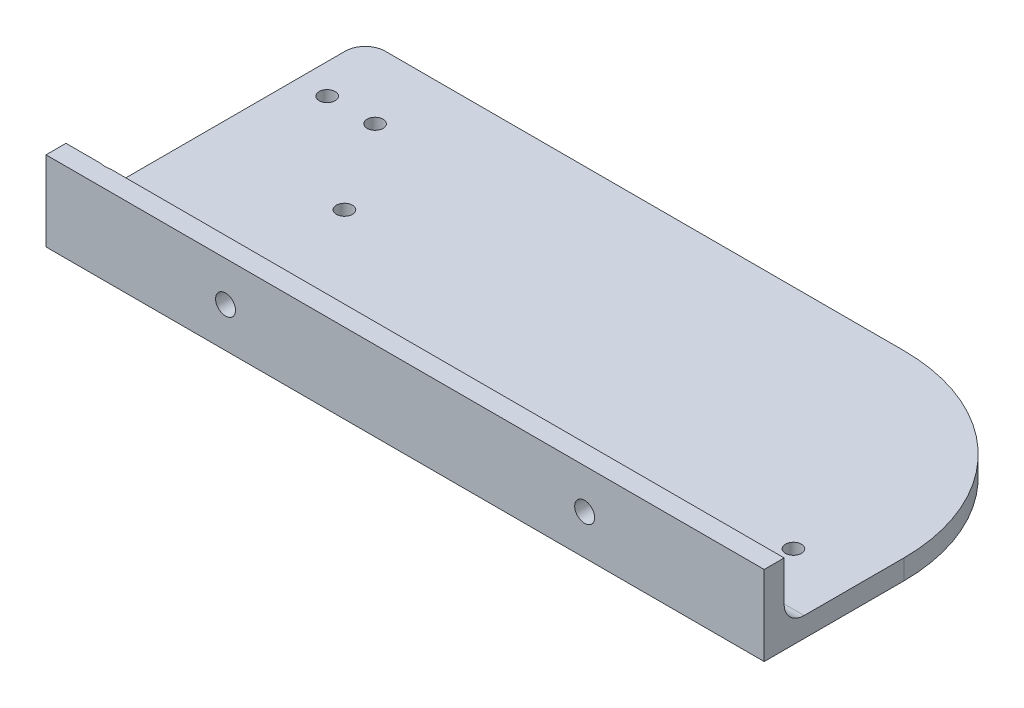
ISO-10303-21;
HEADER;
FILE_DESCRIPTION(('STEP AP214'),'2;1');
FILE_NAME('part.step','',(''),(''),'','','');
FILE_SCHEMA(('AUTOMOTIVE_DESIGN { 1 0 10303 214 1 1 1 1 }'));
ENDSEC;
DATA;
#1=APPLICATION_CONTEXT('core data for automotive mechanical design processes');
#2=APPLICATION_PROTOCOL_DEFINITION('international standard','automotive_design',2000,#1);
#3=PRODUCT_CONTEXT('',#1,'mechanical');
#4=PRODUCT('Part','Part','',(#3));
#5=PRODUCT_RELATED_PRODUCT_CATEGORY('part','',(#4));
#6=PRODUCT_DEFINITION_FORMATION('','',#4);
#7=PRODUCT_DEFINITION_CONTEXT('part definition',#1,'design');
#8=PRODUCT_DEFINITION('design','',#6,#7);
#9=PRODUCT_DEFINITION_SHAPE('','',#8);
#10=(LENGTH_UNIT() NAMED_UNIT(*) SI_UNIT(.MILLI.,.METRE.));
#11=(NAMED_UNIT(*) PLANE_ANGLE_UNIT() SI_UNIT($,.RADIAN.));
#12=(NAMED_UNIT(*) SI_UNIT($,.STERADIAN.) SOLID_ANGLE_UNIT());
#13=UNCERTAINTY_MEASURE_WITH_UNIT(LENGTH_MEASURE(1.E-05),#10,'distance_accuracy_value','');
#14=(GEOMETRIC_REPRESENTATION_CONTEXT(3) GLOBAL_UNCERTAINTY_ASSIGNED_CONTEXT((#13)) GLOBAL_UNIT_ASSIGNED_CONTEXT((#10,
#11,#12)) REPRESENTATION_CONTEXT('',''));
#15=CARTESIAN_POINT('',(0.,0.,0.));
#16=DIRECTION('',(0.,0.,1.));
#17=DIRECTION('',(1.,0.,0.));
#18=AXIS2_PLACEMENT_3D('',#15,#16,#17);
#19=CARTESIAN_POINT('',(-43.5930960469009,25.4,45.0477144987486));
#20=DIRECTION('',(0.,0.,-1.));
#21=DIRECTION('',(-1.,0.,0.));
#22=AXIS2_PLACEMENT_3D('',#19,#20,#21);
#23=PLANE('',#22);
#24=DIRECTION('',(0.,-1.,0.));
#25=VECTOR('',#24,1.);
#26=CARTESIAN_POINT('',(185.006903953099,25.4,45.0477144987486));
#27=LINE('',#26,#25);
#28=CARTESIAN_POINT('',(185.006903953099,25.4,45.0477144987486));
#29=VERTEX_POINT('',#28);
#30=CARTESIAN_POINT('',(185.006903953099,12.7,45.0477144987486));
#31=VERTEX_POINT('',#30);
#32=EDGE_CURVE('E186',#29,#31,#27,.T.);
#33=ORIENTED_EDGE('',*,*,#32,.T.);
#34=DIRECTION('',(1.,0.,0.));
#35=VECTOR('',#34,1.);
#36=CARTESIAN_POINT('',(-29.2310409014925,12.7,45.0477144987486));
#37=LINE('',#36,#35);
#38=CARTESIAN_POINT('',(131.031903953099,12.7,45.0477144987486));
#39=VERTEX_POINT('',#38);
#40=EDGE_CURVE('E244',#31,#39,#37,.F.);
#41=ORIENTED_EDGE('',*,*,#40,.T.);
#42=CARTESIAN_POINT('',(127.856903953099,12.7,45.0477144987486));
#43=DIRECTION('',(0.,0.,-1.));
#44=DIRECTION('',(-1.,0.,0.));
#45=AXIS2_PLACEMENT_3D('',#42,#43,#44);
#46=CIRCLE('',#45,3.175);
#47=CARTESIAN_POINT('',(124.681903953099,12.7,45.0477144987486));
#48=VERTEX_POINT('',#47);
#49=EDGE_CURVE('E408',#39,#48,#46,.F.);
#50=ORIENTED_EDGE('',*,*,#49,.T.);
#51=DIRECTION('',(1.,0.,0.));
#52=VECTOR('',#51,1.);
#53=CARTESIAN_POINT('',(-29.2310409014925,12.7,45.0477144987486));
#54=LINE('',#53,#52);
#55=CARTESIAN_POINT('',(16.7319039530991,12.7,45.0477144987486));
#56=VERTEX_POINT('',#55);
#57=EDGE_CURVE('E242',#48,#56,#54,.F.);
#58=ORIENTED_EDGE('',*,*,#57,.T.);
#59=CARTESIAN_POINT('',(13.5569039530991,12.7,45.0477144987486));
#60=DIRECTION('',(0.,0.,-1.));
#61=DIRECTION('',(-1.,0.,0.));
#62=AXIS2_PLACEMENT_3D('',#59,#60,#61);
#63=CIRCLE('',#62,3.175);
#64=CARTESIAN_POINT('',(10.3819039530991,12.7,45.0477144987486));
#65=VERTEX_POINT('',#64);
#66=EDGE_CURVE('E416',#56,#65,#63,.F.);
#67=ORIENTED_EDGE('',*,*,#66,.T.);
#68=DIRECTION('',(1.,0.,0.));
#69=VECTOR('',#68,1.);
#70=CARTESIAN_POINT('',(-29.2310409014925,12.7,45.0477144987486));
#71=LINE('',#70,#69);
#72=CARTESIAN_POINT('',(-29.2310409014925,12.7,45.0477144987486));
#73=VERTEX_POINT('',#72);
#74=EDGE_CURVE('E72',#65,#73,#71,.F.);
#75=ORIENTED_EDGE('',*,*,#74,.T.);
#76=DIRECTION('',(0.,-1.,0.));
#77=VECTOR('',#76,1.);
#78=CARTESIAN_POINT('',(-29.2310409014925,0.,45.0477144987486));
#79=LINE('',#78,#77);
#80=CARTESIAN_POINT('',(-29.2310409014925,25.4,45.0477144987486));
#81=VERTEX_POINT('',#80);
#82=EDGE_CURVE('E154',#81,#73,#79,.T.);
#83=ORIENTED_EDGE('',*,*,#82,.F.);
#84=DIRECTION('',(1.,0.,0.));
#85=VECTOR('',#84,1.);
#86=CARTESIAN_POINT('',(-43.5930960469009,25.4,45.0477144987486));
#87=LINE('',#86,#85);
#88=EDGE_CURVE('E165',#81,#29,#87,.T.);
#89=ORIENTED_EDGE('',*,*,#88,.T.);
#90=EDGE_LOOP('',(#33,#41,#50,#58,#67,#75,#83,#89));
#91=FACE_BOUND('',#90,.T.);
#92=ADVANCED_FACE('F43',(#91),#23,.T.);
#93=CARTESIAN_POINT('',(0.,6.35,0.));
#94=DIRECTION('',(0.,1.,0.));
#95=DIRECTION('',(0.,0.,1.));
#96=AXIS2_PLACEMENT_3D('',#93,#94,#95);
#97=PLANE('',#96);
#98=DIRECTION('',(0.,0.,1.));
#99=VECTOR('',#98,1.);
#100=CARTESIAN_POINT('',(-43.5930960469009,6.35,-50.2022855012514));
#101=LINE('',#100,#99);
#102=CARTESIAN_POINT('',(-43.5930960469009,6.35,-43.8522855012514));
#103=VERTEX_POINT('',#102);
#104=CARTESIAN_POINT('',(-43.5930960469009,6.35,38.6977144987486));
#105=VERTEX_POINT('',#104);
#106=EDGE_CURVE('E191',#103,#105,#101,.T.);
#107=ORIENTED_EDGE('',*,*,#106,.T.);
#108=DIRECTION('',(1.,0.,0.));
#109=VECTOR('',#108,1.);
#110=CARTESIAN_POINT('',(-32.5551511923092,6.35,38.6977144987486));
#111=LINE('',#110,#109);
#112=CARTESIAN_POINT('',(-38.0117968722261,6.35,38.6977144987486));
#113=VERTEX_POINT('',#112);
#114=EDGE_CURVE('E236',#105,#113,#111,.T.);
#115=ORIENTED_EDGE('',*,*,#114,.T.);
#116=CARTESIAN_POINT('',(-30.8930960469009,6.35,38.1));
#117=DIRECTION('',(0.,1.,0.));
#118=DIRECTION('',(0.,0.,1.));
#119=AXIS2_PLACEMENT_3D('',#116,#117,#118);
#120=CIRCLE('',#119,7.14374999999999);
#121=CARTESIAN_POINT('',(-23.7743952215757,6.35,38.6977144987486));
#122=VERTEX_POINT('',#121);
#123=EDGE_CURVE('E162',#122,#113,#120,.T.);
#124=ORIENTED_EDGE('',*,*,#123,.F.);
#125=DIRECTION('',(1.,0.,0.));
#126=VECTOR('',#125,1.);
#127=CARTESIAN_POINT('',(185.006903953099,6.35,38.6977144987486));
#128=LINE('',#127,#126);
#129=CARTESIAN_POINT('',(185.006903953099,6.35,38.6977144987486));
#130=VERTEX_POINT('',#129);
#131=EDGE_CURVE('E233',#122,#130,#128,.T.);
#132=ORIENTED_EDGE('',*,*,#131,.T.);
#133=DIRECTION('',(0.,0.,-1.));
#134=VECTOR('',#133,1.);
#135=CARTESIAN_POINT('',(185.006903953099,6.35,-50.2022855012514));
#136=LINE('',#135,#134);
#137=CARTESIAN_POINT('',(185.006903953099,6.35,6.94771449874861));
#138=VERTEX_POINT('',#137);
#139=EDGE_CURVE('E194',#130,#138,#136,.T.);
#140=ORIENTED_EDGE('',*,*,#139,.T.);
#141=CARTESIAN_POINT('',(127.856903953099,6.35,6.94771449874861));
#142=DIRECTION('',(0.,1.,0.));
#143=DIRECTION('',(0.,0.,1.));
#144=AXIS2_PLACEMENT_3D('',#141,#142,#143);
#145=CIRCLE('',#144,57.15);
#146=CARTESIAN_POINT('',(127.856903953099,6.35,-50.2022855012514));
#147=VERTEX_POINT('',#146);
#148=EDGE_CURVE('E228',#138,#147,#145,.T.);
#149=ORIENTED_EDGE('',*,*,#148,.T.);
#150=DIRECTION('',(-1.,0.,0.));
#151=VECTOR('',#150,1.);
#152=CARTESIAN_POINT('',(-43.5930960469009,6.35,-50.2022855012514));
#153=LINE('',#152,#151);
#154=CARTESIAN_POINT('',(-37.2430960469009,6.35,-50.2022855012514));
#155=VERTEX_POINT('',#154);
#156=EDGE_CURVE('E197',#147,#155,#153,.T.);
#157=ORIENTED_EDGE('',*,*,#156,.T.);
#158=CARTESIAN_POINT('',(-37.2430960469009,6.35,-43.8522855012514));
#159=DIRECTION('',(0.,1.,0.));
#160=DIRECTION('',(0.,0.,1.));
#161=AXIS2_PLACEMENT_3D('',#158,#159,#160);
#162=CIRCLE('',#161,6.35);
#163=EDGE_CURVE('E226',#155,#103,#162,.T.);
#164=ORIENTED_EDGE('',*,*,#163,.T.);
#165=EDGE_LOOP('',(#107,#115,#124,#132,#140,#149,#157,#164));
#166=FACE_BOUND('',#165,.T.);
#167=CARTESIAN_POINT('',(-34.0680960469009,6.35,-28.575));
#168=DIRECTION('',(0.,1.,0.));
#169=DIRECTION('',(0.,0.,1.));
#170=AXIS2_PLACEMENT_3D('',#167,#168,#169);
#171=CIRCLE('',#170,2.5527);
#172=CARTESIAN_POINT('',(-34.0680960469009,6.35,-26.0223));
#173=VERTEX_POINT('',#172);
#174=EDGE_CURVE('E423',#173,#173,#171,.T.);
#175=ORIENTED_EDGE('',*,*,#174,.F.);
#176=EDGE_LOOP('',(#175));
#177=FACE_BOUND('',#176,.T.);
#178=CARTESIAN_POINT('',(-18.8280960469009,6.35,-28.575));
#179=DIRECTION('',(0.,1.,0.));
#180=DIRECTION('',(0.,0.,1.));
#181=AXIS2_PLACEMENT_3D('',#178,#179,#180);
#182=CIRCLE('',#181,2.5527);
#183=CARTESIAN_POINT('',(-18.8280960469009,6.35,-26.0223));
#184=VERTEX_POINT('',#183);
#185=EDGE_CURVE('E429',#184,#184,#182,.T.);
#186=ORIENTED_EDGE('',*,*,#185,.F.);
#187=EDGE_LOOP('',(#186));
#188=FACE_BOUND('',#187,.T.);
#189=CARTESIAN_POINT('',(0.,6.35,0.));
#190=DIRECTION('',(0.,1.,0.));
#191=DIRECTION('',(0.,0.,1.));
#192=AXIS2_PLACEMENT_3D('',#189,#190,#191);
#193=CIRCLE('',#192,2.5527);
#194=CARTESIAN_POINT('',(0.,6.35,2.5527));
#195=VERTEX_POINT('',#194);
#196=EDGE_CURVE('E435',#195,#195,#193,.T.);
#197=ORIENTED_EDGE('',*,*,#196,.F.);
#198=EDGE_LOOP('',(#197));
#199=FACE_BOUND('',#198,.T.);
#200=CARTESIAN_POINT('',(164.907701135125,6.35,21.9875101453017));
#201=DIRECTION('',(0.,1.,0.));
#202=DIRECTION('',(0.,0.,1.));
#203=AXIS2_PLACEMENT_3D('',#200,#201,#202);
#204=CIRCLE('',#203,2.55269999999999);
#205=CARTESIAN_POINT('',(164.907701135125,6.35,24.5402101453017));
#206=VERTEX_POINT('',#205);
#207=EDGE_CURVE('E441',#206,#206,#204,.T.);
#208=ORIENTED_EDGE('',*,*,#207,.F.);
#209=EDGE_LOOP('',(#208));
#210=FACE_BOUND('',#209,.T.);
#211=ADVANCED_FACE('F276',(#166,#177,#188,#199,#210),#97,.T.);
#212=CARTESIAN_POINT('',(-43.5930960469009,6.35,-50.2022855012514));
#213=DIRECTION('',(1.,0.,0.));
#214=DIRECTION('',(0.,0.,-1.));
#215=AXIS2_PLACEMENT_3D('',#212,#213,#214);
#216=PLANE('',#215);
#217=ORIENTED_EDGE('',*,*,#106,.F.);
#218=DIRECTION('',(0.,-1.,0.));
#219=VECTOR('',#218,1.);
#220=CARTESIAN_POINT('',(-43.5930960469009,6.35,-43.8522855012514));
#221=LINE('',#220,#219);
#222=CARTESIAN_POINT('',(-43.5930960469009,0.,-43.8522855012514));
#223=VERTEX_POINT('',#222);
#224=EDGE_CURVE('E230',#103,#223,#221,.T.);
#225=ORIENTED_EDGE('',*,*,#224,.T.);
#226=DIRECTION('',(0.,0.,1.));
#227=VECTOR('',#226,1.);
#228=CARTESIAN_POINT('',(-43.5930960469009,0.,-50.2022855012514));
#229=LINE('',#228,#227);
#230=CARTESIAN_POINT('',(-43.5930960469009,0.,51.3977144987486));
#231=VERTEX_POINT('',#230);
#232=EDGE_CURVE('E188',#223,#231,#229,.T.);
#233=ORIENTED_EDGE('',*,*,#232,.T.);
#234=DIRECTION('',(0.,-1.,0.));
#235=VECTOR('',#234,1.);
#236=CARTESIAN_POINT('',(-43.5930960469009,6.35,51.3977144987486));
#237=LINE('',#236,#235);
#238=CARTESIAN_POINT('',(-43.5930960469009,25.4,51.3977144987486));
#239=VERTEX_POINT('',#238);
#240=EDGE_CURVE('E211',#239,#231,#237,.T.);
#241=ORIENTED_EDGE('',*,*,#240,.F.);
#242=DIRECTION('',(0.,0.,-1.));
#243=VECTOR('',#242,1.);
#244=CARTESIAN_POINT('',(-43.5930960469009,25.4,51.3977144987486));
#245=LINE('',#244,#243);
#246=CARTESIAN_POINT('',(-43.5930960469009,25.4,45.0477144987486));
#247=VERTEX_POINT('',#246);
#248=EDGE_CURVE('E174',#239,#247,#245,.T.);
#249=ORIENTED_EDGE('',*,*,#248,.T.);
#250=DIRECTION('',(0.,-1.,0.));
#251=VECTOR('',#250,1.);
#252=CARTESIAN_POINT('',(-43.5930960469009,25.4,45.0477144987486));
#253=LINE('',#252,#251);
#254=CARTESIAN_POINT('',(-43.5930960469009,12.7,45.0477144987486));
#255=VERTEX_POINT('',#254);
#256=EDGE_CURVE('E185',#247,#255,#253,.T.);
#257=ORIENTED_EDGE('',*,*,#256,.T.);
#258=CARTESIAN_POINT('',(-43.5930960469009,12.7,38.6977144987486));
#259=DIRECTION('',(1.,0.,0.));
#260=DIRECTION('',(0.,0.,-1.));
#261=AXIS2_PLACEMENT_3D('',#258,#259,#260);
#262=CIRCLE('',#261,6.35);
#263=EDGE_CURVE('E252',#255,#105,#262,.T.);
#264=ORIENTED_EDGE('',*,*,#263,.T.);
#265=EDGE_LOOP('',(#217,#225,#233,#241,#249,#257,#264));
#266=FACE_BOUND('',#265,.T.);
#267=ADVANCED_FACE('F272',(#266),#216,.F.);
#268=CARTESIAN_POINT('',(-43.5930960469009,6.35,51.3977144987486));
#269=DIRECTION('',(0.,0.,-1.));
#270=DIRECTION('',(-1.,0.,0.));
#271=AXIS2_PLACEMENT_3D('',#268,#269,#270);
#272=PLANE('',#271);
#273=CARTESIAN_POINT('',(127.856903953099,12.7,51.3977144987486));
#274=DIRECTION('',(0.,0.,1.));
#275=DIRECTION('',(1.,0.,0.));
#276=AXIS2_PLACEMENT_3D('',#273,#274,#275);
#277=CIRCLE('',#276,3.175);
#278=CARTESIAN_POINT('',(131.031903953099,12.7,51.3977144987486));
#279=VERTEX_POINT('',#278);
#280=EDGE_CURVE('E410',#279,#279,#277,.T.);
#281=ORIENTED_EDGE('',*,*,#280,.F.);
#282=EDGE_LOOP('',(#281));
#283=FACE_BOUND('',#282,.T.);
#284=CARTESIAN_POINT('',(13.5569039530991,12.7,51.3977144987486));
#285=DIRECTION('',(0.,0.,1.));
#286=DIRECTION('',(-1.,0.,0.));
#287=AXIS2_PLACEMENT_3D('',#284,#285,#286);
#288=CIRCLE('',#287,3.175);
#289=CARTESIAN_POINT('',(10.3819039530991,12.7,51.3977144987486));
#290=VERTEX_POINT('',#289);
#291=EDGE_CURVE('E411',#290,#290,#288,.T.);
#292=ORIENTED_EDGE('',*,*,#291,.F.);
#293=EDGE_LOOP('',(#292));
#294=FACE_BOUND('',#293,.T.);
#295=DIRECTION('',(1.,0.,0.));
#296=VECTOR('',#295,1.);
#297=CARTESIAN_POINT('',(-43.5930960469009,0.,51.3977144987486));
#298=LINE('',#297,#296);
#299=CARTESIAN_POINT('',(185.006903953099,0.,51.3977144987486));
#300=VERTEX_POINT('',#299);
#301=EDGE_CURVE('E202',#231,#300,#298,.T.);
#302=ORIENTED_EDGE('',*,*,#301,.T.);
#303=DIRECTION('',(0.,-1.,0.));
#304=VECTOR('',#303,1.);
#305=CARTESIAN_POINT('',(185.006903953099,6.35,51.3977144987486));
#306=LINE('',#305,#304);
#307=CARTESIAN_POINT('',(185.006903953099,25.4,51.3977144987486));
#308=VERTEX_POINT('',#307);
#309=EDGE_CURVE('E200',#308,#300,#306,.T.);
#310=ORIENTED_EDGE('',*,*,#309,.F.);
#311=DIRECTION('',(-1.,0.,0.));
#312=VECTOR('',#311,1.);
#313=CARTESIAN_POINT('',(-43.5930960469009,25.4,51.3977144987486));
#314=LINE('',#313,#312);
#315=EDGE_CURVE('E182',#308,#239,#314,.T.);
#316=ORIENTED_EDGE('',*,*,#315,.T.);
#317=ORIENTED_EDGE('',*,*,#240,.T.);
#318=EDGE_LOOP('',(#302,#310,#316,#317));
#319=FACE_BOUND('',#318,.T.);
#320=ADVANCED_FACE('F275',(#283,#294,#319),#272,.F.);
#321=CARTESIAN_POINT('',(185.006903953099,6.35,-50.2022855012514));
#322=DIRECTION('',(-1.,0.,0.));
#323=DIRECTION('',(0.,0.,1.));
#324=AXIS2_PLACEMENT_3D('',#321,#322,#323);
#325=PLANE('',#324);
#326=DIRECTION('',(0.,0.,-1.));
#327=VECTOR('',#326,1.);
#328=CARTESIAN_POINT('',(185.006903953099,0.,-50.2022855012514));
#329=LINE('',#328,#327);
#330=CARTESIAN_POINT('',(185.006903953099,0.,6.94771449874861));
#331=VERTEX_POINT('',#330);
#332=EDGE_CURVE('E204',#300,#331,#329,.T.);
#333=ORIENTED_EDGE('',*,*,#332,.T.);
#334=DIRECTION('',(0.,-1.,0.));
#335=VECTOR('',#334,1.);
#336=CARTESIAN_POINT('',(185.006903953099,6.35,6.94771449874861));
#337=LINE('',#336,#335);
#338=EDGE_CURVE('E223',#331,#138,#337,.F.);
#339=ORIENTED_EDGE('',*,*,#338,.T.);
#340=ORIENTED_EDGE('',*,*,#139,.F.);
#341=CARTESIAN_POINT('',(185.006903953099,12.7,38.6977144987486));
#342=DIRECTION('',(-1.,0.,0.));
#343=DIRECTION('',(0.,0.,1.));
#344=AXIS2_PLACEMENT_3D('',#341,#342,#343);
#345=CIRCLE('',#344,6.35);
#346=EDGE_CURVE('E64',#130,#31,#345,.T.);
#347=ORIENTED_EDGE('',*,*,#346,.T.);
#348=ORIENTED_EDGE('',*,*,#32,.F.);
#349=DIRECTION('',(0.,0.,1.));
#350=VECTOR('',#349,1.);
#351=CARTESIAN_POINT('',(185.006903953099,25.4,51.3977144987486));
#352=LINE('',#351,#350);
#353=EDGE_CURVE('E172',#29,#308,#352,.T.);
#354=ORIENTED_EDGE('',*,*,#353,.T.);
#355=ORIENTED_EDGE('',*,*,#309,.T.);
#356=EDGE_LOOP('',(#333,#339,#340,#347,#348,#354,#355));
#357=FACE_BOUND('',#356,.T.);
#358=ADVANCED_FACE('F280',(#357),#325,.F.);
#359=CARTESIAN_POINT('',(-43.5930960469009,6.35,-50.2022855012514));
#360=DIRECTION('',(0.,0.,1.));
#361=DIRECTION('',(1.,0.,0.));
#362=AXIS2_PLACEMENT_3D('',#359,#360,#361);
#363=PLANE('',#362);
#364=ORIENTED_EDGE('',*,*,#156,.F.);
#365=DIRECTION('',(0.,-1.,0.));
#366=VECTOR('',#365,1.);
#367=CARTESIAN_POINT('',(127.856903953099,6.35,-50.2022855012514));
#368=LINE('',#367,#366);
#369=CARTESIAN_POINT('',(127.856903953099,0.,-50.2022855012514));
#370=VERTEX_POINT('',#369);
#371=EDGE_CURVE('E216',#147,#370,#368,.T.);
#372=ORIENTED_EDGE('',*,*,#371,.T.);
#373=DIRECTION('',(-1.,0.,0.));
#374=VECTOR('',#373,1.);
#375=CARTESIAN_POINT('',(-43.5930960469009,0.,-50.2022855012514));
#376=LINE('',#375,#374);
#377=CARTESIAN_POINT('',(-37.2430960469009,0.,-50.2022855012514));
#378=VERTEX_POINT('',#377);
#379=EDGE_CURVE('E195',#370,#378,#376,.T.);
#380=ORIENTED_EDGE('',*,*,#379,.T.);
#381=DIRECTION('',(0.,-1.,0.));
#382=VECTOR('',#381,1.);
#383=CARTESIAN_POINT('',(-37.2430960469009,6.35,-50.2022855012514));
#384=LINE('',#383,#382);
#385=EDGE_CURVE('E166',#378,#155,#384,.F.);
#386=ORIENTED_EDGE('',*,*,#385,.T.);
#387=EDGE_LOOP('',(#364,#372,#380,#386));
#388=FACE_BOUND('',#387,.T.);
#389=ADVANCED_FACE('F284',(#388),#363,.F.);
#390=CARTESIAN_POINT('',(0.,0.,0.));
#391=DIRECTION('',(0.,1.,0.));
#392=DIRECTION('',(0.,0.,1.));
#393=AXIS2_PLACEMENT_3D('',#390,#391,#392);
#394=PLANE('',#393);
#395=CARTESIAN_POINT('',(-30.8930960469009,0.,38.1));
#396=DIRECTION('',(0.,-1.,0.));
#397=DIRECTION('',(0.,0.,-1.));
#398=AXIS2_PLACEMENT_3D('',#395,#396,#397);
#399=CIRCLE('',#398,7.14374999999999);
#400=CARTESIAN_POINT('',(-30.8930960469009,0.,30.95625));
#401=VERTEX_POINT('',#400);
#402=EDGE_CURVE('E163',#401,#401,#399,.T.);
#403=ORIENTED_EDGE('',*,*,#402,.F.);
#404=EDGE_LOOP('',(#403));
#405=FACE_BOUND('',#404,.T.);
#406=CARTESIAN_POINT('',(-34.0680960469009,0.,-28.575));
#407=DIRECTION('',(0.,1.,0.));
#408=DIRECTION('',(0.,0.,1.));
#409=AXIS2_PLACEMENT_3D('',#406,#407,#408);
#410=CIRCLE('',#409,2.5527);
#411=CARTESIAN_POINT('',(-34.0680960469009,0.,-26.0223));
#412=VERTEX_POINT('',#411);
#413=EDGE_CURVE('E426',#412,#412,#410,.T.);
#414=ORIENTED_EDGE('',*,*,#413,.T.);
#415=EDGE_LOOP('',(#414));
#416=FACE_BOUND('',#415,.T.);
#417=CARTESIAN_POINT('',(-18.8280960469009,0.,-28.575));
#418=DIRECTION('',(0.,1.,0.));
#419=DIRECTION('',(0.,0.,1.));
#420=AXIS2_PLACEMENT_3D('',#417,#418,#419);
#421=CIRCLE('',#420,2.5527);
#422=CARTESIAN_POINT('',(-18.8280960469009,0.,-26.0223));
#423=VERTEX_POINT('',#422);
#424=EDGE_CURVE('E432',#423,#423,#421,.T.);
#425=ORIENTED_EDGE('',*,*,#424,.T.);
#426=EDGE_LOOP('',(#425));
#427=FACE_BOUND('',#426,.T.);
#428=CARTESIAN_POINT('',(0.,0.,0.));
#429=DIRECTION('',(0.,1.,0.));
#430=DIRECTION('',(0.,0.,1.));
#431=AXIS2_PLACEMENT_3D('',#428,#429,#430);
#432=CIRCLE('',#431,2.5527);
#433=CARTESIAN_POINT('',(0.,0.,2.5527));
#434=VERTEX_POINT('',#433);
#435=EDGE_CURVE('E438',#434,#434,#432,.T.);
#436=ORIENTED_EDGE('',*,*,#435,.T.);
#437=EDGE_LOOP('',(#436));
#438=FACE_BOUND('',#437,.T.);
#439=CARTESIAN_POINT('',(164.907701135125,0.,21.9875101453017));
#440=DIRECTION('',(0.,1.,0.));
#441=DIRECTION('',(0.,0.,1.));
#442=AXIS2_PLACEMENT_3D('',#439,#440,#441);
#443=CIRCLE('',#442,2.55269999999999);
#444=CARTESIAN_POINT('',(164.907701135125,0.,24.5402101453017));
#445=VERTEX_POINT('',#444);
#446=EDGE_CURVE('E177',#445,#445,#443,.T.);
#447=ORIENTED_EDGE('',*,*,#446,.T.);
#448=EDGE_LOOP('',(#447));
#449=FACE_BOUND('',#448,.T.);
#450=ORIENTED_EDGE('',*,*,#379,.F.);
#451=CARTESIAN_POINT('',(127.856903953099,0.,6.94771449874861));
#452=DIRECTION('',(0.,1.,0.));
#453=DIRECTION('',(0.,0.,1.));
#454=AXIS2_PLACEMENT_3D('',#451,#452,#453);
#455=CIRCLE('',#454,57.15);
#456=EDGE_CURVE('E221',#370,#331,#455,.F.);
#457=ORIENTED_EDGE('',*,*,#456,.T.);
#458=ORIENTED_EDGE('',*,*,#332,.F.);
#459=ORIENTED_EDGE('',*,*,#301,.F.);
#460=ORIENTED_EDGE('',*,*,#232,.F.);
#461=CARTESIAN_POINT('',(-37.2430960469009,0.,-43.8522855012514));
#462=DIRECTION('',(0.,1.,0.));
#463=DIRECTION('',(0.,0.,1.));
#464=AXIS2_PLACEMENT_3D('',#461,#462,#463);
#465=CIRCLE('',#464,6.35);
#466=EDGE_CURVE('E219',#223,#378,#465,.F.);
#467=ORIENTED_EDGE('',*,*,#466,.T.);
#468=EDGE_LOOP('',(#450,#457,#458,#459,#460,#467));
#469=FACE_BOUND('',#468,.T.);
#470=ADVANCED_FACE('F287',(#405,#416,#427,#438,#449,#469),#394,.F.);
#471=DIRECTION('',(0.,-1.,0.));
#472=VECTOR('',#471,1.);
#473=CARTESIAN_POINT('',(-32.5551511923092,0.,45.0477144987486));
#474=LINE('',#473,#472);
#475=CARTESIAN_POINT('',(-32.5551511923092,12.7,45.0477144987486));
#476=VERTEX_POINT('',#475);
#477=CARTESIAN_POINT('',(-32.5551511923092,25.4,45.0477144987486));
#478=VERTEX_POINT('',#477);
#479=EDGE_CURVE('E157',#476,#478,#474,.F.);
#480=ORIENTED_EDGE('',*,*,#479,.F.);
#481=DIRECTION('',(1.,0.,0.));
#482=VECTOR('',#481,1.);
#483=CARTESIAN_POINT('',(-43.5930960469009,12.7,45.0477144987486));
#484=LINE('',#483,#482);
#485=EDGE_CURVE('E239',#476,#255,#484,.F.);
#486=ORIENTED_EDGE('',*,*,#485,.T.);
#487=ORIENTED_EDGE('',*,*,#256,.F.);
#488=EDGE_CURVE('E173',#247,#478,#87,.T.);
#489=ORIENTED_EDGE('',*,*,#488,.T.);
#490=EDGE_LOOP('',(#480,#486,#487,#489));
#491=FACE_BOUND('',#490,.T.);
#492=ADVANCED_FACE('F291',(#491),#23,.T.);
#493=CARTESIAN_POINT('',(0.,25.4,0.));
#494=DIRECTION('',(0.,-1.,0.));
#495=DIRECTION('',(0.,0.,-1.));
#496=AXIS2_PLACEMENT_3D('',#493,#494,#495);
#497=PLANE('',#496);
#498=ORIENTED_EDGE('',*,*,#88,.F.);
#499=CARTESIAN_POINT('',(-30.8930960469009,25.4,38.1));
#500=DIRECTION('',(0.,-1.,0.));
#501=DIRECTION('',(0.,0.,-1.));
#502=AXIS2_PLACEMENT_3D('',#499,#500,#501);
#503=CIRCLE('',#502,7.14374999999999);
#504=EDGE_CURVE('E151',#81,#478,#503,.T.);
#505=ORIENTED_EDGE('',*,*,#504,.T.);
#506=ORIENTED_EDGE('',*,*,#488,.F.);
#507=ORIENTED_EDGE('',*,*,#248,.F.);
#508=ORIENTED_EDGE('',*,*,#315,.F.);
#509=ORIENTED_EDGE('',*,*,#353,.F.);
#510=EDGE_LOOP('',(#498,#505,#506,#507,#508,#509));
#511=FACE_BOUND('',#510,.T.);
#512=ADVANCED_FACE('F169',(#511),#497,.F.);
#513=CARTESIAN_POINT('',(164.907701135125,6.35,21.9875101453017));
#514=DIRECTION('',(0.,1.,0.));
#515=DIRECTION('',(0.,0.,1.));
#516=AXIS2_PLACEMENT_3D('',#513,#514,#515);
#517=CYLINDRICAL_SURFACE('',#516,2.55269999999999);
#518=ORIENTED_EDGE('',*,*,#207,.T.);
#519=EDGE_LOOP('',(#518));
#520=FACE_BOUND('',#519,.T.);
#521=ORIENTED_EDGE('',*,*,#446,.F.);
#522=EDGE_LOOP('',(#521));
#523=FACE_BOUND('',#522,.T.);
#524=ADVANCED_FACE('F301',(#520,#523),#517,.F.);
#525=CARTESIAN_POINT('',(0.,6.35,0.));
#526=DIRECTION('',(0.,1.,0.));
#527=DIRECTION('',(0.,0.,1.));
#528=AXIS2_PLACEMENT_3D('',#525,#526,#527);
#529=CYLINDRICAL_SURFACE('',#528,2.5527);
#530=ORIENTED_EDGE('',*,*,#196,.T.);
#531=EDGE_LOOP('',(#530));
#532=FACE_BOUND('',#531,.T.);
#533=ORIENTED_EDGE('',*,*,#435,.F.);
#534=EDGE_LOOP('',(#533));
#535=FACE_BOUND('',#534,.T.);
#536=ADVANCED_FACE('F304',(#532,#535),#529,.F.);
#537=CARTESIAN_POINT('',(-18.8280960469009,6.35,-28.575));
#538=DIRECTION('',(0.,1.,0.));
#539=DIRECTION('',(0.,0.,1.));
#540=AXIS2_PLACEMENT_3D('',#537,#538,#539);
#541=CYLINDRICAL_SURFACE('',#540,2.5527);
#542=ORIENTED_EDGE('',*,*,#424,.F.);
#543=EDGE_LOOP('',(#542));
#544=FACE_BOUND('',#543,.T.);
#545=ORIENTED_EDGE('',*,*,#185,.T.);
#546=EDGE_LOOP('',(#545));
#547=FACE_BOUND('',#546,.T.);
#548=ADVANCED_FACE('F308',(#544,#547),#541,.F.);
#549=CARTESIAN_POINT('',(-34.0680960469009,6.35,-28.575));
#550=DIRECTION('',(0.,1.,0.));
#551=DIRECTION('',(0.,0.,1.));
#552=AXIS2_PLACEMENT_3D('',#549,#550,#551);
#553=CYLINDRICAL_SURFACE('',#552,2.5527);
#554=ORIENTED_EDGE('',*,*,#413,.F.);
#555=EDGE_LOOP('',(#554));
#556=FACE_BOUND('',#555,.T.);
#557=ORIENTED_EDGE('',*,*,#174,.T.);
#558=EDGE_LOOP('',(#557));
#559=FACE_BOUND('',#558,.T.);
#560=ADVANCED_FACE('F311',(#556,#559),#553,.F.);
#561=CARTESIAN_POINT('',(-30.8930960469009,0.,38.1));
#562=DIRECTION('',(0.,-1.,0.));
#563=DIRECTION('',(0.,0.,-1.));
#564=AXIS2_PLACEMENT_3D('',#561,#562,#563);
#565=CYLINDRICAL_SURFACE('',#564,7.14374999999999);
#566=ORIENTED_EDGE('',*,*,#82,.T.);
#567=CARTESIAN_POINT('',(-29.2310409014925,12.7,45.0477144987486));
#568=CARTESIAN_POINT('',(-29.2310916638811,12.6481002452176,45.0477209639409));
#569=CARTESIAN_POINT('',(-29.2283800680972,12.5962543527964,45.0470780970673));
#570=CARTESIAN_POINT('',(-29.2178741496231,12.493261057616,45.0445550363938));
#571=CARTESIAN_POINT('',(-29.2100950680485,12.4421120283939,45.0426785527002));
#572=CARTESIAN_POINT('',(-29.180224227524,12.2923052710152,45.0353902068767));
#573=CARTESIAN_POINT('',(-29.1515596786143,12.1950245994661,45.0283135611741));
#574=CARTESIAN_POINT('',(-29.0879684338155,12.0228010070694,45.011985476607));
#575=CARTESIAN_POINT('',(-29.0550925580567,11.9469852926863,45.0033533318993));
#576=CARTESIAN_POINT('',(-28.9833222482109,11.7985178655995,44.9838444129889));
#577=CARTESIAN_POINT('',(-28.9444232748227,11.7258685926402,44.9729659437662));
#578=CARTESIAN_POINT('',(-28.8618663269142,11.5824217350851,44.9490249008474));
#579=CARTESIAN_POINT('',(-28.8181515891484,11.5116619848497,44.9359350250333));
#580=CARTESIAN_POINT('',(-28.7276895799193,11.3725573109295,44.9078210675296));
#581=CARTESIAN_POINT('',(-28.6809432146839,11.3042116749568,44.8927975625392));
#582=CARTESIAN_POINT('',(-28.5573221817877,11.130086255497,44.8515692730684));
#583=CARTESIAN_POINT('',(-28.4788198849518,11.0257964800366,44.823964768705));
#584=CARTESIAN_POINT('',(-28.3186258430994,10.8209975456212,44.7642788046666));
#585=CARTESIAN_POINT('',(-28.2369327469068,10.7204900244599,44.7321954332373));
#586=CARTESIAN_POINT('',(-27.9889462974337,10.4232521106315,44.6292442871791));
#587=CARTESIAN_POINT('',(-27.8199332241336,10.2310556344335,44.5517359007772));
#588=CARTESIAN_POINT('',(-27.4811309123169,9.85641679874424,44.3791623816747));
#589=CARTESIAN_POINT('',(-27.3113442942781,9.67395335877045,44.2841373590612));
#590=CARTESIAN_POINT('',(-26.9739230756217,9.31782448067753,44.0759935851062));
#591=CARTESIAN_POINT('',(-26.80628680909,9.144151880879,43.962889884876));
#592=CARTESIAN_POINT('',(-26.4974465481174,8.8283210520455,43.7341221259257));
#593=CARTESIAN_POINT('',(-26.3556798431626,8.68503338847389,43.6207766578672));
#594=CARTESIAN_POINT('',(-26.0770410952274,8.40608211651871,43.3794656362505));
#595=CARTESIAN_POINT('',(-25.940170082119,8.27042010890001,43.2514970300004));
#596=CARTESIAN_POINT('',(-25.6731313017099,8.00809130548496,42.9806986911463));
#597=CARTESIAN_POINT('',(-25.5429542093498,7.88141189762443,42.837890518214));
#598=CARTESIAN_POINT('',(-25.290884905405,7.63839630425699,42.5370002429247));
#599=CARTESIAN_POINT('',(-25.1689931178124,7.5220606479875,42.3789173599006));
#600=CARTESIAN_POINT('',(-24.8828814959727,7.25196851445137,41.9725624221827));
#601=CARTESIAN_POINT('',(-24.7242316071213,7.10486520314576,41.7156664324758));
#602=CARTESIAN_POINT('',(-24.5080994280292,6.90916632729869,41.3075966266378));
#603=CARTESIAN_POINT('',(-24.4397536917125,6.84814166293822,41.1679377819047));
#604=CARTESIAN_POINT('',(-24.3111723724805,6.7352878843055,40.8813780603656));
#605=CARTESIAN_POINT('',(-24.2509330292517,6.68345450290196,40.734480584848));
#606=CARTESIAN_POINT('',(-24.1408227348807,6.5910849066134,40.437616095544));
#607=CARTESIAN_POINT('',(-24.0907433595695,6.55031414317449,40.2877997540047));
#608=CARTESIAN_POINT('',(-24.0001137755234,6.47944265495867,39.9828828206501));
#609=CARTESIAN_POINT('',(-23.9595609862004,6.44933903950909,39.8277836729207));
#610=CARTESIAN_POINT('',(-23.8883339398926,6.40034037826324,39.5117275774242));
#611=CARTESIAN_POINT('',(-23.8577720153594,6.38157090430264,39.3507252441967));
#612=CARTESIAN_POINT('',(-23.820223068045,6.36269016311928,39.107177642769));
#613=CARTESIAN_POINT('',(-23.8090837822157,6.35794208728613,39.0255917742227));
#614=CARTESIAN_POINT('',(-23.789619264501,6.35159609825926,38.8619540146337));
#615=CARTESIAN_POINT('',(-23.7812943531337,6.34999854376608,38.7799020715927));
#616=CARTESIAN_POINT('',(-23.7743952215757,6.35,38.6977144987486));
#617=B_SPLINE_CURVE_WITH_KNOTS('',3,(#567,#568,#569,#570,#571,#572,#573,#574,#575,#576,#577,
#578,#579,#580,#581,#582,#583,#584,#585,#586,#587,#588,#589,#590,#591,#592,#593,#594,#595,#596,
#597,#598,#599,#600,#601,#602,#603,#604,#605,#606,#607,#608,#609,#610,#611,#612,#613,#614,#615,
#616),.UNSPECIFIED.,.F.,.F.,(4,2,2,2,2,2,2,2,2,2,2,2,2,2,2,2,2,2,2,2,2,2,2,2,4),(0.,
0.155532980793017,0.3106003225479,0.614061245472323,0.862992546645762,1.11211237605429,
1.36456889168719,1.6169502866411,2.01697123143923,2.41716344574999,3.21849764082508,
4.01801921149789,4.81687858746964,5.5100447279557,6.20335583744445,6.89567339134364,
7.58802634726846,8.59126364329447,9.09187488701182,9.59225310571695,10.0810026759904,
10.5696196993613,11.0635553100349,11.310898564834,11.5582699791117),.UNSPECIFIED.);
#618=EDGE_CURVE('E12',#73,#122,#617,.T.);
#619=ORIENTED_EDGE('',*,*,#618,.T.);
#620=ORIENTED_EDGE('',*,*,#123,.T.);
#621=CARTESIAN_POINT('',(-38.0117968722261,6.35,38.6977144987486));
#622=CARTESIAN_POINT('',(-37.9990457601248,6.34996318620176,38.8500453676331));
#623=CARTESIAN_POINT('',(-37.9813325577903,6.3554794978711,39.0019201450206));
#624=CARTESIAN_POINT('',(-37.9364023187684,6.37715327434153,39.3033482787243));
#625=CARTESIAN_POINT('',(-37.909194258532,6.39330070121144,39.4529036887841));
#626=CARTESIAN_POINT('',(-37.8459408138164,6.43559159313512,39.7473111701236));
#627=CARTESIAN_POINT('',(-37.8099730218082,6.46164836264914,39.8921925323079));
#628=CARTESIAN_POINT('',(-37.7296694128816,6.52312697687038,40.1775955717703));
#629=CARTESIAN_POINT('',(-37.6853319729709,6.55855063848423,40.3181163973151));
#630=CARTESIAN_POINT('',(-37.5891498402976,6.63788848085773,40.5934329247356));
#631=CARTESIAN_POINT('',(-37.5373348514937,6.68176928745002,40.7282486705066));
#632=CARTESIAN_POINT('',(-37.4267840055797,6.77735309793194,40.992159148863));
#633=CARTESIAN_POINT('',(-37.3680456229436,6.82905895822151,41.121251769981));
#634=CARTESIAN_POINT('',(-37.1823022240251,6.99498254412522,41.4997050162548));
#635=CARTESIAN_POINT('',(-37.0458867339324,7.11990837055445,41.7399111420991));
#636=CARTESIAN_POINT('',(-36.7934821573193,7.35536163625252,42.1320416710904));
#637=CARTESIAN_POINT('',(-36.682003642344,7.46058882981441,42.2902277621167));
#638=CARTESIAN_POINT('',(-36.450565063834,7.68133693399002,42.5926515995891));
#639=CARTESIAN_POINT('',(-36.3306039726088,7.79685909231355,42.736887650915));
#640=CARTESIAN_POINT('',(-36.0835250734214,8.03699404125578,43.0119139899104));
#641=CARTESIAN_POINT('',(-35.9563878340655,8.16163181374782,43.1426647654597));
#642=CARTESIAN_POINT('',(-35.6967524482144,8.41848805262698,43.3905820478541));
#643=CARTESIAN_POINT('',(-35.5642550127772,8.55070551449291,43.5077503485661));
#644=CARTESIAN_POINT('',(-35.2524980370585,8.86490595270906,43.7640463844423));
#645=CARTESIAN_POINT('',(-35.0717475506201,9.0493616342607,43.8983357112498));
#646=CARTESIAN_POINT('',(-34.7061184828467,9.42886105479422,44.1450507897509));
#647=CARTESIAN_POINT('',(-34.5212363607779,9.62391409773156,44.2574569189863));
#648=CARTESIAN_POINT('',(-34.2440322491305,9.92414588690869,44.4099524082549));
#649=CARTESIAN_POINT('',(-34.1517576201874,10.0253767588015,44.4580521596611));
#650=CARTESIAN_POINT('',(-33.9678198934461,10.2307010784637,44.5490117264941));
#651=CARTESIAN_POINT('',(-33.8761567260898,10.3347941934863,44.5918721478848));
#652=CARTESIAN_POINT('',(-33.694433273313,10.5461122802162,44.6723307419289));
#653=CARTESIAN_POINT('',(-33.6043710858595,10.6533330712966,44.7099355820156));
#654=CARTESIAN_POINT('',(-33.4270815542872,10.8717248336895,44.7799063305007));
#655=CARTESIAN_POINT('',(-33.3398532918006,10.9828945003735,44.8122739498953));
#656=CARTESIAN_POINT('',(-33.1657526898028,11.2166061214679,44.8732668620253));
#657=CARTESIAN_POINT('',(-33.0791602534794,11.3394375547575,44.9015910152551));
#658=CARTESIAN_POINT('',(-32.9161289342084,11.5931337427118,44.9518392497386));
#659=CARTESIAN_POINT('',(-32.8396835001918,11.7239932337393,44.9737674713689));
#660=CARTESIAN_POINT('',(-32.7270813596655,11.9542963872191,45.0044890216981));
#661=CARTESIAN_POINT('',(-32.6857827018551,12.050895339479,45.0152467902674));
#662=CARTESIAN_POINT('',(-32.6179730228723,12.2493386899854,45.0324751186464));
#663=CARTESIAN_POINT('',(-32.5913859848431,12.3511530963047,45.038967750222));
#664=CARTESIAN_POINT('',(-32.5683883974242,12.4950817716378,45.0445374528998));
#665=CARTESIAN_POINT('',(-32.5634605190473,12.5358062607757,45.0457227125496));
#666=CARTESIAN_POINT('',(-32.5568280949837,12.6176784784862,45.047313550336));
#667=CARTESIAN_POINT('',(-32.5551352719842,12.6588272051072,45.0477162929976));
#668=CARTESIAN_POINT('',(-32.5551511923092,12.7,45.0477144987486));
#669=B_SPLINE_CURVE_WITH_KNOTS('',3,(#621,#622,#623,#624,#625,#626,#627,#628,#629,#630,#631,
#632,#633,#634,#635,#636,#637,#638,#639,#640,#641,#642,#643,#644,#645,#646,#647,#648,#649,#650,
#651,#652,#653,#654,#655,#656,#657,#658,#659,#660,#661,#662,#663,#664,#665,#666,#667,#668),
.UNSPECIFIED.,.F.,.F.,(4,2,2,2,2,2,2,2,2,2,2,2,2,2,2,2,2,2,2,2,2,2,2,4),(0.,0.458351026481741,
0.916269896004285,1.37027137503364,1.82436098192522,2.27669402251439,2.72919257947587,
3.63526960573666,4.29533240764906,4.95547531569158,5.6175005626778,6.27943827469398,
7.15153151337041,8.0244031839724,8.45983068471203,8.89520777758134,9.33002742068873,
9.7647047204498,10.2231342383372,10.6812663319985,10.9973036057239,11.311692249789,
11.4346860156481,11.5581246281811),.UNSPECIFIED.);
#670=EDGE_CURVE('E246',#113,#476,#669,.T.);
#671=ORIENTED_EDGE('',*,*,#670,.T.);
#672=ORIENTED_EDGE('',*,*,#479,.T.);
#673=ORIENTED_EDGE('',*,*,#504,.F.);
#674=EDGE_LOOP('',(#566,#619,#620,#671,#672,#673));
#675=FACE_BOUND('',#674,.T.);
#676=ORIENTED_EDGE('',*,*,#402,.T.);
#677=EDGE_LOOP('',(#676));
#678=FACE_BOUND('',#677,.T.);
#679=ADVANCED_FACE('F152',(#675,#678),#565,.F.);
#680=CARTESIAN_POINT('',(127.856903953099,6.35,6.94771449874861));
#681=DIRECTION('',(0.,-1.,0.));
#682=DIRECTION('',(0.,0.,-1.));
#683=AXIS2_PLACEMENT_3D('',#680,#681,#682);
#684=CYLINDRICAL_SURFACE('',#683,57.15);
#685=ORIENTED_EDGE('',*,*,#148,.F.);
#686=ORIENTED_EDGE('',*,*,#338,.F.);
#687=ORIENTED_EDGE('',*,*,#456,.F.);
#688=ORIENTED_EDGE('',*,*,#371,.F.);
#689=EDGE_LOOP('',(#685,#686,#687,#688));
#690=FACE_BOUND('',#689,.T.);
#691=ADVANCED_FACE('F267',(#690),#684,.T.);
#692=CARTESIAN_POINT('',(-37.2430960469009,6.35,-43.8522855012514));
#693=DIRECTION('',(0.,-1.,0.));
#694=DIRECTION('',(0.,0.,-1.));
#695=AXIS2_PLACEMENT_3D('',#692,#693,#694);
#696=CYLINDRICAL_SURFACE('',#695,6.35);
#697=ORIENTED_EDGE('',*,*,#163,.F.);
#698=ORIENTED_EDGE('',*,*,#385,.F.);
#699=ORIENTED_EDGE('',*,*,#466,.F.);
#700=ORIENTED_EDGE('',*,*,#224,.F.);
#701=EDGE_LOOP('',(#697,#698,#699,#700));
#702=FACE_BOUND('',#701,.T.);
#703=ADVANCED_FACE('F263',(#702),#696,.T.);
#704=CARTESIAN_POINT('',(13.5569039530991,12.7,-50.2032855012514));
#705=DIRECTION('',(0.,0.,1.));
#706=DIRECTION('',(1.,0.,0.));
#707=AXIS2_PLACEMENT_3D('',#704,#705,#706);
#708=CYLINDRICAL_SURFACE('',#707,3.175);
#709=ORIENTED_EDGE('',*,*,#66,.F.);
#710=CARTESIAN_POINT('',(16.7319039530991,12.7,45.0477144987486));
#711=CARTESIAN_POINT('',(16.7319174173029,12.6161868641069,45.0477293755838));
#712=CARTESIAN_POINT('',(16.7285856033192,12.5323832679772,45.0460555297341));
#713=CARTESIAN_POINT('',(16.7153360015615,12.3654607991599,45.0394420042332));
#714=CARTESIAN_POINT('',(16.7054208586004,12.2823416650645,45.0345036360876));
#715=CARTESIAN_POINT('',(16.6791683894003,12.1177576031168,45.0215019112873));
#716=CARTESIAN_POINT('',(16.6628602430572,12.0362869034774,45.013452755677));
#717=CARTESIAN_POINT('',(16.6240224382585,11.8752078657657,44.9944443658534));
#718=CARTESIAN_POINT('',(16.6014923944273,11.7955996433839,44.9834849513844));
#719=CARTESIAN_POINT('',(16.5249629317736,11.560563274253,44.9466517133709));
#720=CARTESIAN_POINT('',(16.4619680059907,11.4085776987776,44.9167939318795));
#721=CARTESIAN_POINT('',(16.314253749415,11.1174756130362,44.8491819664757));
#722=CARTESIAN_POINT('',(16.2295127075792,10.9783721540936,44.81141989801));
#723=CARTESIAN_POINT('',(16.0349307768133,10.7076616892692,44.7288236737504));
#724=CARTESIAN_POINT('',(15.9238892642417,10.5770047580365,44.683701187124));
#725=CARTESIAN_POINT('',(15.6824932683739,10.3353150725581,44.5924149430305));
#726=CARTESIAN_POINT('',(15.5521261936772,10.2242952168888,44.546250523451));
#727=CARTESIAN_POINT('',(15.2634813621722,10.0163110267842,44.4539503142253));
#728=CARTESIAN_POINT('',(15.1038226321665,9.92110652069813,44.4080948718239));
#729=CARTESIAN_POINT('',(14.8523508380204,9.79980417727817,44.3469109270934));
#730=CARTESIAN_POINT('',(14.7664997167741,9.76294563641815,44.3277778243472));
#731=CARTESIAN_POINT('',(14.5913161792875,9.69677422203384,44.2927601633908));
#732=CARTESIAN_POINT('',(14.5019858569644,9.66745688831456,44.2768736861344));
#733=CARTESIAN_POINT('',(14.3258943739184,9.61825763434674,44.2498407643382));
#734=CARTESIAN_POINT('',(14.2392951345692,9.59791918170214,44.2384690494568));
#735=CARTESIAN_POINT('',(14.0643206800554,9.5645446745264,44.2196514315942));
#736=CARTESIAN_POINT('',(13.9759464328317,9.55150474628522,44.2122034462073));
#737=CARTESIAN_POINT('',(13.7982022904882,9.53292322788361,44.2015534635416));
#738=CARTESIAN_POINT('',(13.7088330028182,9.52737729140456,44.19834900515));
#739=CARTESIAN_POINT('',(13.5299252072438,9.5238521646991,44.1963123559608));
#740=CARTESIAN_POINT('',(13.4403867162975,9.52587225261347,44.1974797480538));
#741=CARTESIAN_POINT('',(13.194154375235,9.5418808155178,44.2067064673829));
#742=CARTESIAN_POINT('',(13.0380588284882,9.56378798193147,44.2193233522091));
#743=CARTESIAN_POINT('',(12.7322540731479,9.62996345602781,44.2563799539466));
#744=CARTESIAN_POINT('',(12.5825467751587,9.67423840335699,44.2808231812952));
#745=CARTESIAN_POINT('',(12.2893616631086,9.78468428294612,44.339292958735));
#746=CARTESIAN_POINT('',(12.1461101369982,9.85134115452815,44.3735294448088));
#747=CARTESIAN_POINT('',(11.8721416502261,10.0042894179656,44.4477460264873));
#748=CARTESIAN_POINT('',(11.7414307069199,10.0905901692385,44.4877288566063));
#749=CARTESIAN_POINT('',(11.4788032542346,10.2931394979668,44.5750561950228));
#750=CARTESIAN_POINT('',(11.3488337793193,10.4117974657701,44.6226914584833));
#751=CARTESIAN_POINT('',(11.1098283679476,10.669392743561,44.7158477714804));
#752=CARTESIAN_POINT('',(11.0008037339722,10.8083409319939,44.761367669513));
#753=CARTESIAN_POINT('',(10.8019394894883,11.1109764455085,44.8477785773501));
#754=CARTESIAN_POINT('',(10.7132405006566,11.2755188149455,44.8883520538987));
#755=CARTESIAN_POINT('',(10.6025237755816,11.5333644385567,44.9402460818024));
#756=CARTESIAN_POINT('',(10.5693455502827,11.6211288296296,44.9560469556014));
#757=CARTESIAN_POINT('',(10.5107651573978,11.7997304165421,44.9842216935998));
#758=CARTESIAN_POINT('',(10.485360036273,11.8905664306542,44.9965968592914));
#759=CARTESIAN_POINT('',(10.4368886502846,12.0995606484314,45.0203564434783));
#760=CARTESIAN_POINT('',(10.41632176317,12.2184523903165,45.0305636347586));
#761=CARTESIAN_POINT('',(10.3957009551482,12.3982151221185,45.0408248887671));
#762=CARTESIAN_POINT('',(10.3905322488177,12.458408301172,45.0434037455141));
#763=CARTESIAN_POINT('',(10.3836327859518,12.5790613384442,45.0468498565199));
#764=CARTESIAN_POINT('',(10.3819032416958,12.6395212831722,45.047716507238));
#765=CARTESIAN_POINT('',(10.3819039530991,12.7,45.0477144987486));
#766=B_SPLINE_CURVE_WITH_KNOTS('',3,(#710,#711,#712,#713,#714,#715,#716,#717,#718,#719,#720,
#721,#722,#723,#724,#725,#726,#727,#728,#729,#730,#731,#732,#733,#734,#735,#736,#737,#738,#739,
#740,#741,#742,#743,#744,#745,#746,#747,#748,#749,#750,#751,#752,#753,#754,#755,#756,#757,#758,
#759,#760,#761,#762,#763,#764,#765),.UNSPECIFIED.,.F.,.F.,(4,2,2,2,2,2,2,2,2,2,2,2,2,2,2,2,2,2,
2,2,2,2,2,2,2,2,2,4),(0.,0.251340642456382,0.502580371369125,0.752686462215378,1.00280804775646,
1.5020101843342,2.00171267021975,2.53138728506782,3.06140853403427,3.63256934148912,
3.91833589745097,4.20393304810651,4.47258918308846,4.7411025926135,5.009460204468,
5.27779221351351,5.74974058996722,6.22182914184532,6.70491257972051,7.18822666852087,
7.73279923072408,8.27766484063192,8.84810377097813,9.13318372784542,9.4181552282588,
9.78034993987072,9.96165428807348,10.1430225334118),.UNSPECIFIED.);
#767=EDGE_CURVE('E57',#56,#65,#766,.T.);
#768=ORIENTED_EDGE('',*,*,#767,.T.);
#769=EDGE_LOOP('',(#709,#768));
#770=FACE_BOUND('',#769,.T.);
#771=ORIENTED_EDGE('',*,*,#291,.T.);
#772=EDGE_LOOP('',(#771));
#773=FACE_BOUND('',#772,.T.);
#774=ADVANCED_FACE('F266',(#770,#773),#708,.F.);
#775=CARTESIAN_POINT('',(127.856903953099,12.7,-50.2032855012514));
#776=DIRECTION('',(0.,0.,1.));
#777=DIRECTION('',(1.,0.,0.));
#778=AXIS2_PLACEMENT_3D('',#775,#776,#777);
#779=CYLINDRICAL_SURFACE('',#778,3.175);
#780=ORIENTED_EDGE('',*,*,#49,.F.);
#781=CARTESIAN_POINT('',(131.031903953099,12.7,45.0477144987486));
#782=CARTESIAN_POINT('',(131.031917417303,12.6161868641069,45.0477293755838));
#783=CARTESIAN_POINT('',(131.028585603319,12.5323832679772,45.0460555297341));
#784=CARTESIAN_POINT('',(131.015336001562,12.3654607991599,45.0394420042332));
#785=CARTESIAN_POINT('',(131.0054208586,12.2823416650645,45.0345036360876));
#786=CARTESIAN_POINT('',(130.9791683894,12.1177576031168,45.0215019112873));
#787=CARTESIAN_POINT('',(130.962860243057,12.0362869034774,45.013452755677));
#788=CARTESIAN_POINT('',(130.924022438258,11.8752078657657,44.9944443658534));
#789=CARTESIAN_POINT('',(130.901492394427,11.7955996433839,44.9834849513844));
#790=CARTESIAN_POINT('',(130.824962931774,11.560563274253,44.9466517133709));
#791=CARTESIAN_POINT('',(130.761968005991,11.4085776987776,44.9167939318795));
#792=CARTESIAN_POINT('',(130.614253749415,11.1174756130362,44.8491819664757));
#793=CARTESIAN_POINT('',(130.529512707579,10.9783721540936,44.81141989801));
#794=CARTESIAN_POINT('',(130.334930776813,10.7076616892692,44.7288236737504));
#795=CARTESIAN_POINT('',(130.223889264242,10.5770047580365,44.683701187124));
#796=CARTESIAN_POINT('',(129.982493268374,10.3353150725581,44.5924149430305));
#797=CARTESIAN_POINT('',(129.852126193677,10.2242952168888,44.546250523451));
#798=CARTESIAN_POINT('',(129.563481362172,10.0163110267842,44.4539503142253));
#799=CARTESIAN_POINT('',(129.403822632167,9.92110652069814,44.4080948718239));
#800=CARTESIAN_POINT('',(129.15235083802,9.79980417727817,44.3469109270934));
#801=CARTESIAN_POINT('',(129.066499716774,9.76294563641815,44.3277778243472));
#802=CARTESIAN_POINT('',(128.891316179288,9.69677422203384,44.2927601633908));
#803=CARTESIAN_POINT('',(128.801985856964,9.66745688831457,44.2768736861344));
#804=CARTESIAN_POINT('',(128.625894373918,9.61825763434676,44.2498407643382));
#805=CARTESIAN_POINT('',(128.539295134569,9.59791918170216,44.2384690494568));
#806=CARTESIAN_POINT('',(128.364320680055,9.56454467452641,44.2196514315942));
#807=CARTESIAN_POINT('',(128.275946432832,9.55150474628523,44.2122034462073));
#808=CARTESIAN_POINT('',(128.098202290488,9.53292322788362,44.2015534635416));
#809=CARTESIAN_POINT('',(128.008833002818,9.52737729140457,44.19834900515));
#810=CARTESIAN_POINT('',(127.829925207244,9.52385216469911,44.1963123559608));
#811=CARTESIAN_POINT('',(127.740386716298,9.52587225261349,44.1974797480538));
#812=CARTESIAN_POINT('',(127.494154375235,9.54188081551782,44.2067064673829));
#813=CARTESIAN_POINT('',(127.338058828488,9.56378798193148,44.2193233522091));
#814=CARTESIAN_POINT('',(127.032254073148,9.62996345602783,44.2563799539466));
#815=CARTESIAN_POINT('',(126.882546775159,9.67423840335701,44.2808231812952));
#816=CARTESIAN_POINT('',(126.589361663109,9.78468428294614,44.339292958735));
#817=CARTESIAN_POINT('',(126.446110136998,9.85134115452817,44.3735294448088));
#818=CARTESIAN_POINT('',(126.172141650226,10.0042894179656,44.4477460264873));
#819=CARTESIAN_POINT('',(126.04143070692,10.0905901692386,44.4877288566063));
#820=CARTESIAN_POINT('',(125.778803254235,10.2931394979668,44.5750561950228));
#821=CARTESIAN_POINT('',(125.648833779319,10.4117974657701,44.6226914584834));
#822=CARTESIAN_POINT('',(125.409828367948,10.669392743561,44.7158477714804));
#823=CARTESIAN_POINT('',(125.300803733972,10.8083409319939,44.761367669513));
#824=CARTESIAN_POINT('',(125.101939489488,11.1109764455085,44.8477785773501));
#825=CARTESIAN_POINT('',(125.013240500657,11.2755188149456,44.8883520538987));
#826=CARTESIAN_POINT('',(124.902523775582,11.5333644385567,44.9402460818024));
#827=CARTESIAN_POINT('',(124.869345550283,11.6211288296297,44.9560469556014));
#828=CARTESIAN_POINT('',(124.810765157398,11.7997304165421,44.9842216935998));
#829=CARTESIAN_POINT('',(124.785360036273,11.8905664306543,44.9965968592914));
#830=CARTESIAN_POINT('',(124.736888650285,12.0995606484314,45.0203564434783));
#831=CARTESIAN_POINT('',(124.71632176317,12.2184523903165,45.0305636347586));
#832=CARTESIAN_POINT('',(124.695700955148,12.3982151221185,45.0408248887671));
#833=CARTESIAN_POINT('',(124.690532248818,12.458408301172,45.0434037455141));
#834=CARTESIAN_POINT('',(124.683632785952,12.5790613384442,45.0468498565199));
#835=CARTESIAN_POINT('',(124.681903241696,12.6395212831722,45.047716507238));
#836=CARTESIAN_POINT('',(124.681903953099,12.7,45.0477144987486));
#837=B_SPLINE_CURVE_WITH_KNOTS('',3,(#781,#782,#783,#784,#785,#786,#787,#788,#789,#790,#791,
#792,#793,#794,#795,#796,#797,#798,#799,#800,#801,#802,#803,#804,#805,#806,#807,#808,#809,#810,
#811,#812,#813,#814,#815,#816,#817,#818,#819,#820,#821,#822,#823,#824,#825,#826,#827,#828,#829,
#830,#831,#832,#833,#834,#835,#836),.UNSPECIFIED.,.F.,.F.,(4,2,2,2,2,2,2,2,2,2,2,2,2,2,2,2,2,2,
2,2,2,2,2,2,2,2,2,4),(0.,0.251340642456382,0.502580371369122,0.752686462215379,1.00280804775646,
1.50201018433418,2.00171267021975,2.53138728506782,3.06140853403426,3.63256934148913,
3.91833589745098,4.20393304810651,4.47258918308845,4.7411025926135,5.00946020446801,
5.2777922135135,5.74974058996722,6.22182914184531,6.70491257972049,7.18822666852088,
7.7327992307241,8.27766484063191,8.84810377097813,9.13318372784543,9.4181552282588,
9.78034993987071,9.96165428807346,10.1430225334118),.UNSPECIFIED.);
#838=EDGE_CURVE('E379',#39,#48,#837,.T.);
#839=ORIENTED_EDGE('',*,*,#838,.T.);
#840=EDGE_LOOP('',(#780,#839));
#841=FACE_BOUND('',#840,.T.);
#842=ORIENTED_EDGE('',*,*,#280,.T.);
#843=EDGE_LOOP('',(#842));
#844=FACE_BOUND('',#843,.T.);
#845=ADVANCED_FACE('F261',(#841,#844),#779,.F.);
#846=CARTESIAN_POINT('',(0.,12.7,38.6977144987486));
#847=DIRECTION('',(-1.,0.,0.));
#848=DIRECTION('',(0.,0.,1.));
#849=AXIS2_PLACEMENT_3D('',#846,#847,#848);
#850=CYLINDRICAL_SURFACE('',#849,6.35);
#851=ORIENTED_EDGE('',*,*,#263,.F.);
#852=ORIENTED_EDGE('',*,*,#485,.F.);
#853=ORIENTED_EDGE('',*,*,#670,.F.);
#854=ORIENTED_EDGE('',*,*,#114,.F.);
#855=EDGE_LOOP('',(#851,#852,#853,#854));
#856=FACE_BOUND('',#855,.T.);
#857=ADVANCED_FACE('F257',(#856),#850,.F.);
#858=CARTESIAN_POINT('',(0.,12.7,38.6977144987486));
#859=DIRECTION('',(-1.,0.,0.));
#860=DIRECTION('',(0.,0.,1.));
#861=AXIS2_PLACEMENT_3D('',#858,#859,#860);
#862=CYLINDRICAL_SURFACE('',#861,6.35);
#863=ORIENTED_EDGE('',*,*,#838,.F.);
#864=ORIENTED_EDGE('',*,*,#40,.F.);
#865=ORIENTED_EDGE('',*,*,#346,.F.);
#866=ORIENTED_EDGE('',*,*,#131,.F.);
#867=ORIENTED_EDGE('',*,*,#618,.F.);
#868=ORIENTED_EDGE('',*,*,#74,.F.);
#869=ORIENTED_EDGE('',*,*,#767,.F.);
#870=ORIENTED_EDGE('',*,*,#57,.F.);
#871=EDGE_LOOP('',(#863,#864,#865,#866,#867,#868,#869,#870));
#872=FACE_BOUND('',#871,.T.);
#873=ADVANCED_FACE('F45',(#872),#862,.F.);
#874=CLOSED_SHELL('',(#92,#211,#267,#320,#358,#389,#470,#492,#512,#524,#536,#548,#560,#679,#691,
#703,#774,#845,#857,#873));
#875=MANIFOLD_SOLID_BREP('B2',#874);
#876=ADVANCED_BREP_SHAPE_REPRESENTATION('',(#18,#875),#14);
#877=SHAPE_DEFINITION_REPRESENTATION(#9,#876);
ENDSEC;
END-ISO-10303-21;
